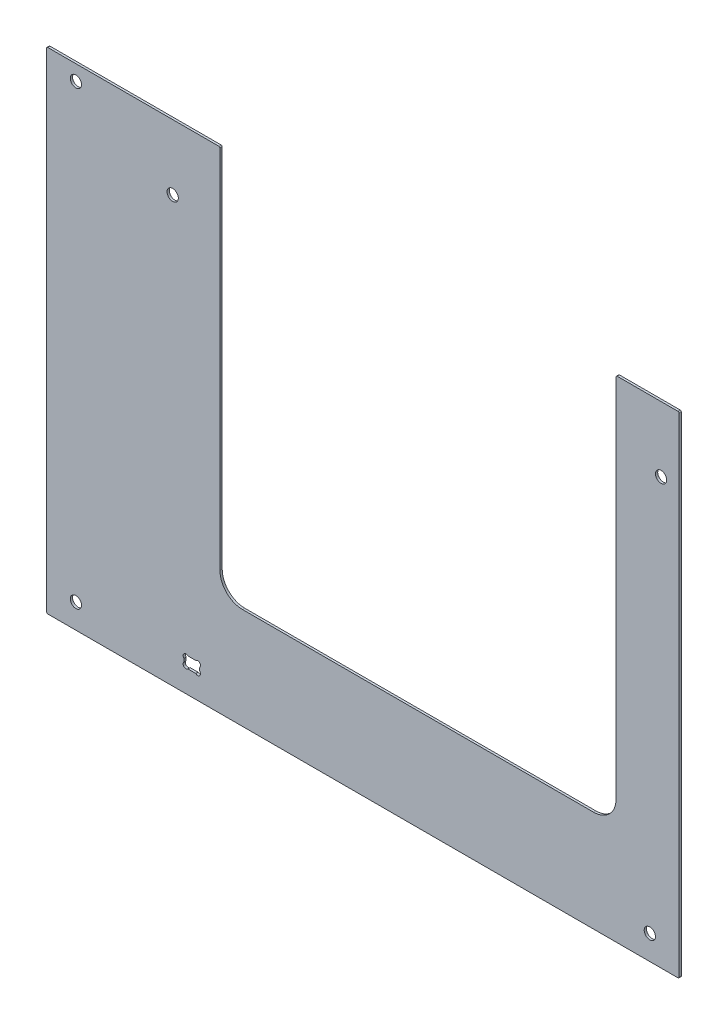
ISO-10303-21;
HEADER;
FILE_DESCRIPTION(('STEP AP214'),'2;1');
FILE_NAME('part.step','',(''),(''),'','','');
FILE_SCHEMA(('AUTOMOTIVE_DESIGN { 1 0 10303 214 1 1 1 1 }'));
ENDSEC;
DATA;
#1=APPLICATION_CONTEXT('core data for automotive mechanical design processes');
#2=APPLICATION_PROTOCOL_DEFINITION('international standard','automotive_design',2000,#1);
#3=PRODUCT_CONTEXT('',#1,'mechanical');
#4=PRODUCT('Part','Part','',(#3));
#5=PRODUCT_RELATED_PRODUCT_CATEGORY('part','',(#4));
#6=PRODUCT_DEFINITION_FORMATION('','',#4);
#7=PRODUCT_DEFINITION_CONTEXT('part definition',#1,'design');
#8=PRODUCT_DEFINITION('design','',#6,#7);
#9=PRODUCT_DEFINITION_SHAPE('','',#8);
#10=(LENGTH_UNIT() NAMED_UNIT(*) SI_UNIT(.MILLI.,.METRE.));
#11=(NAMED_UNIT(*) PLANE_ANGLE_UNIT() SI_UNIT($,.RADIAN.));
#12=(NAMED_UNIT(*) SI_UNIT($,.STERADIAN.) SOLID_ANGLE_UNIT());
#13=UNCERTAINTY_MEASURE_WITH_UNIT(LENGTH_MEASURE(1.E-05),#10,'distance_accuracy_value','');
#14=(GEOMETRIC_REPRESENTATION_CONTEXT(3) GLOBAL_UNCERTAINTY_ASSIGNED_CONTEXT((#13)) GLOBAL_UNIT_ASSIGNED_CONTEXT((#10,
#11,#12)) REPRESENTATION_CONTEXT('',''));
#15=CARTESIAN_POINT('',(0.,0.,0.));
#16=DIRECTION('',(0.,0.,1.));
#17=DIRECTION('',(1.,0.,0.));
#18=AXIS2_PLACEMENT_3D('',#15,#16,#17);
#19=CARTESIAN_POINT('',(243.,55.,1.));
#20=DIRECTION('',(0.,0.,1.));
#21=DIRECTION('',(1.,0.,0.));
#22=AXIS2_PLACEMENT_3D('',#19,#20,#21);
#23=PLANE('',#22);
#24=CARTESIAN_POINT('',(61.8838834764832,10.8838834764832,1.));
#25=DIRECTION('',(0.,0.,1.));
#26=DIRECTION('',(1.,0.,0.));
#27=AXIS2_PLACEMENT_3D('',#24,#25,#26);
#28=CIRCLE('',#27,1.24999999999995);
#29=CARTESIAN_POINT('',(61.,11.7677669529663,1.));
#30=VERTEX_POINT('',#29);
#31=CARTESIAN_POINT('',(62.7677669529663,10.,1.));
#32=VERTEX_POINT('',#31);
#33=EDGE_CURVE('E197',#30,#32,#28,.T.);
#34=ORIENTED_EDGE('',*,*,#33,.F.);
#35=DIRECTION('',(0.,-1.,0.));
#36=VECTOR('',#35,1.);
#37=CARTESIAN_POINT('',(61.,15.,1.));
#38=LINE('',#37,#36);
#39=CARTESIAN_POINT('',(61.,13.2322330470337,1.));
#40=VERTEX_POINT('',#39);
#41=EDGE_CURVE('E211',#40,#30,#38,.T.);
#42=ORIENTED_EDGE('',*,*,#41,.F.);
#43=CARTESIAN_POINT('',(61.8838834764832,14.1161165235168,1.));
#44=DIRECTION('',(0.,0.,1.));
#45=DIRECTION('',(-1.,0.,0.));
#46=AXIS2_PLACEMENT_3D('',#43,#44,#45);
#47=CIRCLE('',#46,1.24999999999995);
#48=CARTESIAN_POINT('',(62.7677669529663,15.,1.));
#49=VERTEX_POINT('',#48);
#50=EDGE_CURVE('E753',#49,#40,#47,.T.);
#51=ORIENTED_EDGE('',*,*,#50,.F.);
#52=DIRECTION('',(-1.,0.,0.));
#53=VECTOR('',#52,1.);
#54=CARTESIAN_POINT('',(61.,15.,1.));
#55=LINE('',#54,#53);
#56=CARTESIAN_POINT('',(66.2322330470337,15.,1.));
#57=VERTEX_POINT('',#56);
#58=EDGE_CURVE('E230',#57,#49,#55,.T.);
#59=ORIENTED_EDGE('',*,*,#58,.F.);
#60=CARTESIAN_POINT('',(67.1161165235169,14.1161165235168,1.));
#61=DIRECTION('',(0.,0.,1.));
#62=DIRECTION('',(1.,0.,0.));
#63=AXIS2_PLACEMENT_3D('',#60,#61,#62);
#64=CIRCLE('',#63,1.24999999999995);
#65=CARTESIAN_POINT('',(68.,13.2322330470337,1.));
#66=VERTEX_POINT('',#65);
#67=EDGE_CURVE('E204',#66,#57,#64,.T.);
#68=ORIENTED_EDGE('',*,*,#67,.F.);
#69=DIRECTION('',(0.,1.,0.));
#70=VECTOR('',#69,1.);
#71=CARTESIAN_POINT('',(68.,15.,1.));
#72=LINE('',#71,#70);
#73=CARTESIAN_POINT('',(68.,11.7677669529663,1.));
#74=VERTEX_POINT('',#73);
#75=EDGE_CURVE('E220',#74,#66,#72,.T.);
#76=ORIENTED_EDGE('',*,*,#75,.F.);
#77=CARTESIAN_POINT('',(67.1161165235169,10.8838834764832,1.));
#78=DIRECTION('',(0.,0.,1.));
#79=DIRECTION('',(-1.,0.,0.));
#80=AXIS2_PLACEMENT_3D('',#77,#78,#79);
#81=CIRCLE('',#80,1.24999999999995);
#82=CARTESIAN_POINT('',(66.2322330470337,10.,1.));
#83=VERTEX_POINT('',#82);
#84=EDGE_CURVE('E761',#83,#74,#81,.T.);
#85=ORIENTED_EDGE('',*,*,#84,.F.);
#86=DIRECTION('',(1.,0.,0.));
#87=VECTOR('',#86,1.);
#88=CARTESIAN_POINT('',(61.,10.,1.));
#89=LINE('',#88,#87);
#90=EDGE_CURVE('E213',#32,#83,#89,.T.);
#91=ORIENTED_EDGE('',*,*,#90,.F.);
#92=EDGE_LOOP('',(#34,#42,#51,#59,#68,#76,#85,#91));
#93=FACE_BOUND('',#92,.T.);
#94=CARTESIAN_POINT('',(273.,189.,1.));
#95=DIRECTION('',(0.,0.,1.));
#96=DIRECTION('',(1.,0.,0.));
#97=AXIS2_PLACEMENT_3D('',#94,#95,#96);
#98=CIRCLE('',#97,2.50000000000002);
#99=CARTESIAN_POINT('',(275.5,189.,1.));
#100=VERTEX_POINT('',#99);
#101=EDGE_CURVE('E736',#100,#100,#98,.T.);
#102=ORIENTED_EDGE('',*,*,#101,.F.);
#103=EDGE_LOOP('',(#102));
#104=FACE_BOUND('',#103,.T.);
#105=CARTESIAN_POINT('',(13.,211.15,1.));
#106=DIRECTION('',(0.,0.,1.));
#107=DIRECTION('',(1.,0.,0.));
#108=AXIS2_PLACEMENT_3D('',#105,#106,#107);
#109=CIRCLE('',#108,2.5);
#110=CARTESIAN_POINT('',(15.5,211.15,1.));
#111=VERTEX_POINT('',#110);
#112=EDGE_CURVE('E246',#111,#111,#109,.T.);
#113=ORIENTED_EDGE('',*,*,#112,.F.);
#114=EDGE_LOOP('',(#113));
#115=FACE_BOUND('',#114,.T.);
#116=DIRECTION('',(0.,-1.,0.));
#117=VECTOR('',#116,1.);
#118=CARTESIAN_POINT('',(0.,0.,1.));
#119=LINE('',#118,#117);
#120=CARTESIAN_POINT('',(0.,217.5,1.));
#121=VERTEX_POINT('',#120);
#122=CARTESIAN_POINT('',(0.,0.5,1.));
#123=VERTEX_POINT('',#122);
#124=EDGE_CURVE('E266',#121,#123,#119,.T.);
#125=ORIENTED_EDGE('',*,*,#124,.T.);
#126=CARTESIAN_POINT('',(0.5,0.5,1.));
#127=DIRECTION('',(0.,0.,1.));
#128=DIRECTION('',(1.,0.,0.));
#129=AXIS2_PLACEMENT_3D('',#126,#127,#128);
#130=CIRCLE('',#129,0.5);
#131=CARTESIAN_POINT('',(0.5,0.,1.));
#132=VERTEX_POINT('',#131);
#133=EDGE_CURVE('E357',#123,#132,#130,.T.);
#134=ORIENTED_EDGE('',*,*,#133,.T.);
#135=DIRECTION('',(1.,0.,0.));
#136=VECTOR('',#135,1.);
#137=CARTESIAN_POINT('',(0.,0.,1.));
#138=LINE('',#137,#136);
#139=CARTESIAN_POINT('',(280.5,0.,1.));
#140=VERTEX_POINT('',#139);
#141=EDGE_CURVE('E269',#132,#140,#138,.T.);
#142=ORIENTED_EDGE('',*,*,#141,.T.);
#143=CARTESIAN_POINT('',(280.5,0.5,1.));
#144=DIRECTION('',(0.,0.,1.));
#145=DIRECTION('',(1.,0.,0.));
#146=AXIS2_PLACEMENT_3D('',#143,#144,#145);
#147=CIRCLE('',#146,0.5);
#148=CARTESIAN_POINT('',(281.,0.5,1.));
#149=VERTEX_POINT('',#148);
#150=EDGE_CURVE('E355',#140,#149,#147,.T.);
#151=ORIENTED_EDGE('',*,*,#150,.T.);
#152=DIRECTION('',(0.,1.,0.));
#153=VECTOR('',#152,1.);
#154=CARTESIAN_POINT('',(281.,0.,1.));
#155=LINE('',#154,#153);
#156=CARTESIAN_POINT('',(281.,217.5,1.));
#157=VERTEX_POINT('',#156);
#158=EDGE_CURVE('E272',#149,#157,#155,.T.);
#159=ORIENTED_EDGE('',*,*,#158,.T.);
#160=CARTESIAN_POINT('',(280.5,217.5,1.));
#161=DIRECTION('',(0.,0.,1.));
#162=DIRECTION('',(1.,0.,0.));
#163=AXIS2_PLACEMENT_3D('',#160,#161,#162);
#164=CIRCLE('',#163,0.5);
#165=CARTESIAN_POINT('',(280.5,218.,1.));
#166=VERTEX_POINT('',#165);
#167=EDGE_CURVE('E353',#157,#166,#164,.T.);
#168=ORIENTED_EDGE('',*,*,#167,.T.);
#169=DIRECTION('',(-1.,0.,0.));
#170=VECTOR('',#169,1.);
#171=CARTESIAN_POINT('',(281.,218.,1.));
#172=LINE('',#171,#170);
#173=CARTESIAN_POINT('',(253.5,218.,1.));
#174=VERTEX_POINT('',#173);
#175=EDGE_CURVE('E275',#166,#174,#172,.T.);
#176=ORIENTED_EDGE('',*,*,#175,.T.);
#177=CARTESIAN_POINT('',(253.5,217.5,1.));
#178=DIRECTION('',(0.,0.,1.));
#179=DIRECTION('',(1.,0.,0.));
#180=AXIS2_PLACEMENT_3D('',#177,#178,#179);
#181=CIRCLE('',#180,0.5);
#182=CARTESIAN_POINT('',(253.,217.5,1.));
#183=VERTEX_POINT('',#182);
#184=EDGE_CURVE('E47',#174,#183,#181,.T.);
#185=ORIENTED_EDGE('',*,*,#184,.T.);
#186=DIRECTION('',(0.,-1.,0.));
#187=VECTOR('',#186,1.);
#188=CARTESIAN_POINT('',(253.,55.0000000000001,1.));
#189=LINE('',#188,#187);
#190=CARTESIAN_POINT('',(253.,55.0000000000001,1.));
#191=VERTEX_POINT('',#190);
#192=EDGE_CURVE('E277',#183,#191,#189,.T.);
#193=ORIENTED_EDGE('',*,*,#192,.T.);
#194=CARTESIAN_POINT('',(243.,55.,1.));
#195=DIRECTION('',(0.,0.,-1.));
#196=DIRECTION('',(1.,0.,0.));
#197=AXIS2_PLACEMENT_3D('',#194,#195,#196);
#198=CIRCLE('',#197,10.);
#199=CARTESIAN_POINT('',(243.,45.,1.));
#200=VERTEX_POINT('',#199);
#201=EDGE_CURVE('E252',#191,#200,#198,.T.);
#202=ORIENTED_EDGE('',*,*,#201,.T.);
#203=DIRECTION('',(-1.,0.,0.));
#204=VECTOR('',#203,1.);
#205=CARTESIAN_POINT('',(87.0000000000001,45.,1.));
#206=LINE('',#205,#204);
#207=CARTESIAN_POINT('',(87.0000000000001,45.,1.));
#208=VERTEX_POINT('',#207);
#209=EDGE_CURVE('E255',#200,#208,#206,.T.);
#210=ORIENTED_EDGE('',*,*,#209,.T.);
#211=CARTESIAN_POINT('',(87.,55.,1.));
#212=DIRECTION('',(0.,0.,-1.));
#213=DIRECTION('',(-1.,0.,0.));
#214=AXIS2_PLACEMENT_3D('',#211,#212,#213);
#215=CIRCLE('',#214,10.);
#216=CARTESIAN_POINT('',(77.,55.0000000000001,1.));
#217=VERTEX_POINT('',#216);
#218=EDGE_CURVE('E258',#208,#217,#215,.T.);
#219=ORIENTED_EDGE('',*,*,#218,.T.);
#220=DIRECTION('',(0.,1.,0.));
#221=VECTOR('',#220,1.);
#222=CARTESIAN_POINT('',(77.,218.,1.));
#223=LINE('',#222,#221);
#224=CARTESIAN_POINT('',(77.,217.5,1.));
#225=VERTEX_POINT('',#224);
#226=EDGE_CURVE('E260',#217,#225,#223,.T.);
#227=ORIENTED_EDGE('',*,*,#226,.T.);
#228=CARTESIAN_POINT('',(76.5,217.5,1.));
#229=DIRECTION('',(0.,0.,1.));
#230=DIRECTION('',(1.,0.,0.));
#231=AXIS2_PLACEMENT_3D('',#228,#229,#230);
#232=CIRCLE('',#231,0.5);
#233=CARTESIAN_POINT('',(76.5,218.,1.));
#234=VERTEX_POINT('',#233);
#235=EDGE_CURVE('E348',#225,#234,#232,.T.);
#236=ORIENTED_EDGE('',*,*,#235,.T.);
#237=DIRECTION('',(-1.,0.,0.));
#238=VECTOR('',#237,1.);
#239=CARTESIAN_POINT('',(0.,218.,1.));
#240=LINE('',#239,#238);
#241=CARTESIAN_POINT('',(0.5,218.,1.));
#242=VERTEX_POINT('',#241);
#243=EDGE_CURVE('E263',#234,#242,#240,.T.);
#244=ORIENTED_EDGE('',*,*,#243,.T.);
#245=CARTESIAN_POINT('',(0.5,217.5,1.));
#246=DIRECTION('',(0.,0.,1.));
#247=DIRECTION('',(1.,0.,0.));
#248=AXIS2_PLACEMENT_3D('',#245,#246,#247);
#249=CIRCLE('',#248,0.5);
#250=EDGE_CURVE('E350',#242,#121,#249,.T.);
#251=ORIENTED_EDGE('',*,*,#250,.T.);
#252=EDGE_LOOP('',(#125,#134,#142,#151,#159,#168,#176,#185,#193,#202,#210,#219,#227,#236,#244,#251));
#253=FACE_BOUND('',#252,.T.);
#254=CARTESIAN_POINT('',(268.,10.85,1.));
#255=DIRECTION('',(0.,0.,1.));
#256=DIRECTION('',(1.,0.,0.));
#257=AXIS2_PLACEMENT_3D('',#254,#255,#256);
#258=CIRCLE('',#257,2.50000000000002);
#259=CARTESIAN_POINT('',(270.5,10.85,1.));
#260=VERTEX_POINT('',#259);
#261=EDGE_CURVE('E240',#260,#260,#258,.T.);
#262=ORIENTED_EDGE('',*,*,#261,.F.);
#263=EDGE_LOOP('',(#262));
#264=FACE_BOUND('',#263,.T.);
#265=CARTESIAN_POINT('',(56.,189.,1.));
#266=DIRECTION('',(0.,0.,1.));
#267=DIRECTION('',(1.,0.,0.));
#268=AXIS2_PLACEMENT_3D('',#265,#266,#267);
#269=CIRCLE('',#268,2.5);
#270=CARTESIAN_POINT('',(58.5,189.,1.));
#271=VERTEX_POINT('',#270);
#272=EDGE_CURVE('E236',#271,#271,#269,.T.);
#273=ORIENTED_EDGE('',*,*,#272,.F.);
#274=EDGE_LOOP('',(#273));
#275=FACE_BOUND('',#274,.T.);
#276=CARTESIAN_POINT('',(13.,10.85,1.));
#277=DIRECTION('',(0.,0.,1.));
#278=DIRECTION('',(1.,0.,0.));
#279=AXIS2_PLACEMENT_3D('',#276,#277,#278);
#280=CIRCLE('',#279,2.5);
#281=CARTESIAN_POINT('',(15.5,10.85,1.));
#282=VERTEX_POINT('',#281);
#283=EDGE_CURVE('E728',#282,#282,#280,.T.);
#284=ORIENTED_EDGE('',*,*,#283,.F.);
#285=EDGE_LOOP('',(#284));
#286=FACE_BOUND('',#285,.T.);
#287=ADVANCED_FACE('F32',(#93,#104,#115,#253,#264,#275,#286),#23,.T.);
#288=CARTESIAN_POINT('',(243.,55.,0.));
#289=DIRECTION('',(0.,0.,1.));
#290=DIRECTION('',(1.,0.,0.));
#291=AXIS2_PLACEMENT_3D('',#288,#289,#290);
#292=PLANE('',#291);
#293=CARTESIAN_POINT('',(273.,189.,0.));
#294=DIRECTION('',(0.,0.,1.));
#295=DIRECTION('',(1.,0.,0.));
#296=AXIS2_PLACEMENT_3D('',#293,#294,#295);
#297=CIRCLE('',#296,2.50000000000002);
#298=CARTESIAN_POINT('',(275.5,189.,0.));
#299=VERTEX_POINT('',#298);
#300=EDGE_CURVE('E731',#299,#299,#297,.T.);
#301=ORIENTED_EDGE('',*,*,#300,.T.);
#302=EDGE_LOOP('',(#301));
#303=FACE_BOUND('',#302,.T.);
#304=DIRECTION('',(0.,-1.,0.));
#305=VECTOR('',#304,1.);
#306=CARTESIAN_POINT('',(61.,15.,0.));
#307=LINE('',#306,#305);
#308=CARTESIAN_POINT('',(61.,13.2322330470337,0.));
#309=VERTEX_POINT('',#308);
#310=CARTESIAN_POINT('',(61.,11.7677669529663,0.));
#311=VERTEX_POINT('',#310);
#312=EDGE_CURVE('E233',#309,#311,#307,.T.);
#313=ORIENTED_EDGE('',*,*,#312,.T.);
#314=CARTESIAN_POINT('',(61.8838834764832,10.8838834764832,0.));
#315=DIRECTION('',(0.,0.,1.));
#316=DIRECTION('',(1.,0.,0.));
#317=AXIS2_PLACEMENT_3D('',#314,#315,#316);
#318=CIRCLE('',#317,1.24999999999995);
#319=CARTESIAN_POINT('',(62.7677669529663,10.,0.));
#320=VERTEX_POINT('',#319);
#321=EDGE_CURVE('E199',#311,#320,#318,.T.);
#322=ORIENTED_EDGE('',*,*,#321,.T.);
#323=DIRECTION('',(1.,0.,0.));
#324=VECTOR('',#323,1.);
#325=CARTESIAN_POINT('',(61.,10.,0.));
#326=LINE('',#325,#324);
#327=CARTESIAN_POINT('',(66.2322330470337,10.,0.));
#328=VERTEX_POINT('',#327);
#329=EDGE_CURVE('E235',#320,#328,#326,.T.);
#330=ORIENTED_EDGE('',*,*,#329,.T.);
#331=CARTESIAN_POINT('',(67.1161165235169,10.8838834764832,0.));
#332=DIRECTION('',(0.,0.,1.));
#333=DIRECTION('',(-1.,0.,0.));
#334=AXIS2_PLACEMENT_3D('',#331,#332,#333);
#335=CIRCLE('',#334,1.24999999999995);
#336=CARTESIAN_POINT('',(68.,11.7677669529663,0.));
#337=VERTEX_POINT('',#336);
#338=EDGE_CURVE('E760',#328,#337,#335,.T.);
#339=ORIENTED_EDGE('',*,*,#338,.T.);
#340=DIRECTION('',(0.,1.,0.));
#341=VECTOR('',#340,1.);
#342=CARTESIAN_POINT('',(68.,15.,0.));
#343=LINE('',#342,#341);
#344=CARTESIAN_POINT('',(68.,13.2322330470337,0.));
#345=VERTEX_POINT('',#344);
#346=EDGE_CURVE('E222',#337,#345,#343,.T.);
#347=ORIENTED_EDGE('',*,*,#346,.T.);
#348=CARTESIAN_POINT('',(67.1161165235169,14.1161165235168,0.));
#349=DIRECTION('',(0.,0.,1.));
#350=DIRECTION('',(1.,0.,0.));
#351=AXIS2_PLACEMENT_3D('',#348,#349,#350);
#352=CIRCLE('',#351,1.24999999999995);
#353=CARTESIAN_POINT('',(66.2322330470337,15.,0.));
#354=VERTEX_POINT('',#353);
#355=EDGE_CURVE('E766',#345,#354,#352,.T.);
#356=ORIENTED_EDGE('',*,*,#355,.T.);
#357=DIRECTION('',(-1.,0.,0.));
#358=VECTOR('',#357,1.);
#359=CARTESIAN_POINT('',(61.,15.,0.));
#360=LINE('',#359,#358);
#361=CARTESIAN_POINT('',(62.7677669529663,15.,0.));
#362=VERTEX_POINT('',#361);
#363=EDGE_CURVE('E218',#354,#362,#360,.T.);
#364=ORIENTED_EDGE('',*,*,#363,.T.);
#365=CARTESIAN_POINT('',(61.8838834764832,14.1161165235168,0.));
#366=DIRECTION('',(0.,0.,1.));
#367=DIRECTION('',(-1.,0.,0.));
#368=AXIS2_PLACEMENT_3D('',#365,#366,#367);
#369=CIRCLE('',#368,1.24999999999995);
#370=EDGE_CURVE('E733',#362,#309,#369,.T.);
#371=ORIENTED_EDGE('',*,*,#370,.T.);
#372=EDGE_LOOP('',(#313,#322,#330,#339,#347,#356,#364,#371));
#373=FACE_BOUND('',#372,.T.);
#374=CARTESIAN_POINT('',(13.,211.15,0.));
#375=DIRECTION('',(0.,0.,1.));
#376=DIRECTION('',(1.,0.,0.));
#377=AXIS2_PLACEMENT_3D('',#374,#375,#376);
#378=CIRCLE('',#377,2.5);
#379=CARTESIAN_POINT('',(15.5,211.15,0.));
#380=VERTEX_POINT('',#379);
#381=EDGE_CURVE('E243',#380,#380,#378,.T.);
#382=ORIENTED_EDGE('',*,*,#381,.T.);
#383=EDGE_LOOP('',(#382));
#384=FACE_BOUND('',#383,.T.);
#385=DIRECTION('',(1.,0.,0.));
#386=VECTOR('',#385,1.);
#387=CARTESIAN_POINT('',(0.,0.,0.));
#388=LINE('',#387,#386);
#389=CARTESIAN_POINT('',(0.5,0.,0.));
#390=VERTEX_POINT('',#389);
#391=CARTESIAN_POINT('',(280.5,0.,0.));
#392=VERTEX_POINT('',#391);
#393=EDGE_CURVE('E295',#390,#392,#388,.T.);
#394=ORIENTED_EDGE('',*,*,#393,.F.);
#395=CARTESIAN_POINT('',(0.5,0.5,0.));
#396=DIRECTION('',(0.,0.,1.));
#397=DIRECTION('',(1.,0.,0.));
#398=AXIS2_PLACEMENT_3D('',#395,#396,#397);
#399=CIRCLE('',#398,0.5);
#400=CARTESIAN_POINT('',(0.,0.5,0.));
#401=VERTEX_POINT('',#400);
#402=EDGE_CURVE('E341',#390,#401,#399,.F.);
#403=ORIENTED_EDGE('',*,*,#402,.T.);
#404=DIRECTION('',(0.,-1.,0.));
#405=VECTOR('',#404,1.);
#406=CARTESIAN_POINT('',(0.,0.,0.));
#407=LINE('',#406,#405);
#408=CARTESIAN_POINT('',(0.,217.5,0.));
#409=VERTEX_POINT('',#408);
#410=EDGE_CURVE('E292',#409,#401,#407,.T.);
#411=ORIENTED_EDGE('',*,*,#410,.F.);
#412=CARTESIAN_POINT('',(0.5,217.5,0.));
#413=DIRECTION('',(0.,0.,1.));
#414=DIRECTION('',(1.,0.,0.));
#415=AXIS2_PLACEMENT_3D('',#412,#413,#414);
#416=CIRCLE('',#415,0.5);
#417=CARTESIAN_POINT('',(0.5,218.,0.));
#418=VERTEX_POINT('',#417);
#419=EDGE_CURVE('E333',#409,#418,#416,.F.);
#420=ORIENTED_EDGE('',*,*,#419,.T.);
#421=DIRECTION('',(-1.,0.,0.));
#422=VECTOR('',#421,1.);
#423=CARTESIAN_POINT('',(0.,218.,0.));
#424=LINE('',#423,#422);
#425=CARTESIAN_POINT('',(76.5,218.,0.));
#426=VERTEX_POINT('',#425);
#427=EDGE_CURVE('E289',#426,#418,#424,.T.);
#428=ORIENTED_EDGE('',*,*,#427,.F.);
#429=CARTESIAN_POINT('',(76.5,217.5,0.));
#430=DIRECTION('',(0.,0.,1.));
#431=DIRECTION('',(1.,0.,0.));
#432=AXIS2_PLACEMENT_3D('',#429,#430,#431);
#433=CIRCLE('',#432,0.5);
#434=CARTESIAN_POINT('',(77.,217.5,0.));
#435=VERTEX_POINT('',#434);
#436=EDGE_CURVE('E331',#426,#435,#433,.F.);
#437=ORIENTED_EDGE('',*,*,#436,.T.);
#438=DIRECTION('',(0.,1.,0.));
#439=VECTOR('',#438,1.);
#440=CARTESIAN_POINT('',(77.,218.,0.));
#441=LINE('',#440,#439);
#442=CARTESIAN_POINT('',(77.,55.0000000000001,0.));
#443=VERTEX_POINT('',#442);
#444=EDGE_CURVE('E286',#443,#435,#441,.T.);
#445=ORIENTED_EDGE('',*,*,#444,.F.);
#446=CARTESIAN_POINT('',(87.,55.,0.));
#447=DIRECTION('',(0.,0.,-1.));
#448=DIRECTION('',(-1.,0.,0.));
#449=AXIS2_PLACEMENT_3D('',#446,#447,#448);
#450=CIRCLE('',#449,10.);
#451=CARTESIAN_POINT('',(87.0000000000001,45.,0.));
#452=VERTEX_POINT('',#451);
#453=EDGE_CURVE('E284',#452,#443,#450,.T.);
#454=ORIENTED_EDGE('',*,*,#453,.F.);
#455=DIRECTION('',(-1.,0.,0.));
#456=VECTOR('',#455,1.);
#457=CARTESIAN_POINT('',(87.0000000000001,45.,0.));
#458=LINE('',#457,#456);
#459=CARTESIAN_POINT('',(243.,45.,0.));
#460=VERTEX_POINT('',#459);
#461=EDGE_CURVE('E282',#460,#452,#458,.T.);
#462=ORIENTED_EDGE('',*,*,#461,.F.);
#463=CARTESIAN_POINT('',(243.,55.,0.));
#464=DIRECTION('',(0.,0.,-1.));
#465=DIRECTION('',(1.,0.,0.));
#466=AXIS2_PLACEMENT_3D('',#463,#464,#465);
#467=CIRCLE('',#466,10.);
#468=CARTESIAN_POINT('',(253.,55.0000000000001,0.));
#469=VERTEX_POINT('',#468);
#470=EDGE_CURVE('E249',#469,#460,#467,.T.);
#471=ORIENTED_EDGE('',*,*,#470,.F.);
#472=DIRECTION('',(0.,-1.,0.));
#473=VECTOR('',#472,1.);
#474=CARTESIAN_POINT('',(253.,55.0000000000001,0.));
#475=LINE('',#474,#473);
#476=CARTESIAN_POINT('',(253.,217.5,0.));
#477=VERTEX_POINT('',#476);
#478=EDGE_CURVE('E256',#477,#469,#475,.T.);
#479=ORIENTED_EDGE('',*,*,#478,.F.);
#480=CARTESIAN_POINT('',(253.5,217.5,0.));
#481=DIRECTION('',(0.,0.,1.));
#482=DIRECTION('',(1.,0.,0.));
#483=AXIS2_PLACEMENT_3D('',#480,#481,#482);
#484=CIRCLE('',#483,0.5);
#485=CARTESIAN_POINT('',(253.5,218.,0.));
#486=VERTEX_POINT('',#485);
#487=EDGE_CURVE('E335',#477,#486,#484,.F.);
#488=ORIENTED_EDGE('',*,*,#487,.T.);
#489=DIRECTION('',(-1.,0.,0.));
#490=VECTOR('',#489,1.);
#491=CARTESIAN_POINT('',(281.,218.,0.));
#492=LINE('',#491,#490);
#493=CARTESIAN_POINT('',(280.5,218.,0.));
#494=VERTEX_POINT('',#493);
#495=EDGE_CURVE('E301',#494,#486,#492,.T.);
#496=ORIENTED_EDGE('',*,*,#495,.F.);
#497=CARTESIAN_POINT('',(280.5,217.5,0.));
#498=DIRECTION('',(0.,0.,1.));
#499=DIRECTION('',(1.,0.,0.));
#500=AXIS2_PLACEMENT_3D('',#497,#498,#499);
#501=CIRCLE('',#500,0.5);
#502=CARTESIAN_POINT('',(281.,217.5,0.));
#503=VERTEX_POINT('',#502);
#504=EDGE_CURVE('E337',#494,#503,#501,.F.);
#505=ORIENTED_EDGE('',*,*,#504,.T.);
#506=DIRECTION('',(0.,1.,0.));
#507=VECTOR('',#506,1.);
#508=CARTESIAN_POINT('',(281.,0.,0.));
#509=LINE('',#508,#507);
#510=CARTESIAN_POINT('',(281.,0.5,0.));
#511=VERTEX_POINT('',#510);
#512=EDGE_CURVE('E298',#511,#503,#509,.T.);
#513=ORIENTED_EDGE('',*,*,#512,.F.);
#514=CARTESIAN_POINT('',(280.5,0.5,0.));
#515=DIRECTION('',(0.,0.,1.));
#516=DIRECTION('',(1.,0.,0.));
#517=AXIS2_PLACEMENT_3D('',#514,#515,#516);
#518=CIRCLE('',#517,0.5);
#519=EDGE_CURVE('E339',#511,#392,#518,.F.);
#520=ORIENTED_EDGE('',*,*,#519,.T.);
#521=EDGE_LOOP('',(#394,#403,#411,#420,#428,#437,#445,#454,#462,#471,#479,#488,#496,#505,#513,#520));
#522=FACE_BOUND('',#521,.T.);
#523=CARTESIAN_POINT('',(268.,10.85,0.));
#524=DIRECTION('',(0.,0.,1.));
#525=DIRECTION('',(1.,0.,0.));
#526=AXIS2_PLACEMENT_3D('',#523,#524,#525);
#527=CIRCLE('',#526,2.50000000000002);
#528=CARTESIAN_POINT('',(270.5,10.85,0.));
#529=VERTEX_POINT('',#528);
#530=EDGE_CURVE('E232',#529,#529,#527,.T.);
#531=ORIENTED_EDGE('',*,*,#530,.T.);
#532=EDGE_LOOP('',(#531));
#533=FACE_BOUND('',#532,.T.);
#534=CARTESIAN_POINT('',(56.,189.,0.));
#535=DIRECTION('',(0.,0.,1.));
#536=DIRECTION('',(1.,0.,0.));
#537=AXIS2_PLACEMENT_3D('',#534,#535,#536);
#538=CIRCLE('',#537,2.5);
#539=CARTESIAN_POINT('',(58.5,189.,0.));
#540=VERTEX_POINT('',#539);
#541=EDGE_CURVE('E225',#540,#540,#538,.T.);
#542=ORIENTED_EDGE('',*,*,#541,.T.);
#543=EDGE_LOOP('',(#542));
#544=FACE_BOUND('',#543,.T.);
#545=CARTESIAN_POINT('',(13.,10.85,0.));
#546=DIRECTION('',(0.,0.,1.));
#547=DIRECTION('',(1.,0.,0.));
#548=AXIS2_PLACEMENT_3D('',#545,#546,#547);
#549=CIRCLE('',#548,2.5);
#550=CARTESIAN_POINT('',(15.5,10.85,0.));
#551=VERTEX_POINT('',#550);
#552=EDGE_CURVE('E726',#551,#551,#549,.T.);
#553=ORIENTED_EDGE('',*,*,#552,.T.);
#554=EDGE_LOOP('',(#553));
#555=FACE_BOUND('',#554,.T.);
#556=ADVANCED_FACE('F392',(#303,#373,#384,#522,#533,#544,#555),#292,.F.);
#557=CARTESIAN_POINT('',(243.,55.,1.));
#558=DIRECTION('',(0.,0.,-1.));
#559=DIRECTION('',(-1.,0.,0.));
#560=AXIS2_PLACEMENT_3D('',#557,#558,#559);
#561=CYLINDRICAL_SURFACE('',#560,10.);
#562=ORIENTED_EDGE('',*,*,#470,.T.);
#563=DIRECTION('',(0.,0.,-1.));
#564=VECTOR('',#563,1.);
#565=CARTESIAN_POINT('',(243.,45.,1.));
#566=LINE('',#565,#564);
#567=EDGE_CURVE('E312',#200,#460,#566,.T.);
#568=ORIENTED_EDGE('',*,*,#567,.F.);
#569=ORIENTED_EDGE('',*,*,#201,.F.);
#570=DIRECTION('',(0.,0.,-1.));
#571=VECTOR('',#570,1.);
#572=CARTESIAN_POINT('',(253.,55.0000000000001,1.));
#573=LINE('',#572,#571);
#574=EDGE_CURVE('E279',#191,#469,#573,.T.);
#575=ORIENTED_EDGE('',*,*,#574,.T.);
#576=EDGE_LOOP('',(#562,#568,#569,#575));
#577=FACE_BOUND('',#576,.T.);
#578=ADVANCED_FACE('F428',(#577),#561,.F.);
#579=CARTESIAN_POINT('',(87.0000000000001,45.,1.));
#580=DIRECTION('',(0.,-1.,0.));
#581=DIRECTION('',(0.,0.,-1.));
#582=AXIS2_PLACEMENT_3D('',#579,#580,#581);
#583=PLANE('',#582);
#584=ORIENTED_EDGE('',*,*,#461,.T.);
#585=DIRECTION('',(0.,0.,-1.));
#586=VECTOR('',#585,1.);
#587=CARTESIAN_POINT('',(87.0000000000001,45.,1.));
#588=LINE('',#587,#586);
#589=EDGE_CURVE('E309',#208,#452,#588,.T.);
#590=ORIENTED_EDGE('',*,*,#589,.F.);
#591=ORIENTED_EDGE('',*,*,#209,.F.);
#592=ORIENTED_EDGE('',*,*,#567,.T.);
#593=EDGE_LOOP('',(#584,#590,#591,#592));
#594=FACE_BOUND('',#593,.T.);
#595=ADVANCED_FACE('F434',(#594),#583,.F.);
#596=CARTESIAN_POINT('',(87.,55.,1.));
#597=DIRECTION('',(0.,0.,-1.));
#598=DIRECTION('',(-1.,0.,0.));
#599=AXIS2_PLACEMENT_3D('',#596,#597,#598);
#600=CYLINDRICAL_SURFACE('',#599,10.);
#601=ORIENTED_EDGE('',*,*,#453,.T.);
#602=DIRECTION('',(0.,0.,-1.));
#603=VECTOR('',#602,1.);
#604=CARTESIAN_POINT('',(77.,55.0000000000001,1.));
#605=LINE('',#604,#603);
#606=EDGE_CURVE('E306',#217,#443,#605,.T.);
#607=ORIENTED_EDGE('',*,*,#606,.F.);
#608=ORIENTED_EDGE('',*,*,#218,.F.);
#609=ORIENTED_EDGE('',*,*,#589,.T.);
#610=EDGE_LOOP('',(#601,#607,#608,#609));
#611=FACE_BOUND('',#610,.T.);
#612=ADVANCED_FACE('F436',(#611),#600,.F.);
#613=CARTESIAN_POINT('',(77.,218.,1.));
#614=DIRECTION('',(-1.,0.,0.));
#615=DIRECTION('',(0.,-1.,0.));
#616=AXIS2_PLACEMENT_3D('',#613,#614,#615);
#617=PLANE('',#616);
#618=ORIENTED_EDGE('',*,*,#444,.T.);
#619=DIRECTION('',(0.,0.,-1.));
#620=VECTOR('',#619,1.);
#621=CARTESIAN_POINT('',(77.,217.5,1.));
#622=LINE('',#621,#620);
#623=EDGE_CURVE('E11',#435,#225,#622,.F.);
#624=ORIENTED_EDGE('',*,*,#623,.T.);
#625=ORIENTED_EDGE('',*,*,#226,.F.);
#626=ORIENTED_EDGE('',*,*,#606,.T.);
#627=EDGE_LOOP('',(#618,#624,#625,#626));
#628=FACE_BOUND('',#627,.T.);
#629=ADVANCED_FACE('F440',(#628),#617,.F.);
#630=CARTESIAN_POINT('',(0.,218.,1.));
#631=DIRECTION('',(0.,-1.,0.));
#632=DIRECTION('',(0.,0.,-1.));
#633=AXIS2_PLACEMENT_3D('',#630,#631,#632);
#634=PLANE('',#633);
#635=ORIENTED_EDGE('',*,*,#427,.T.);
#636=DIRECTION('',(0.,0.,-1.));
#637=VECTOR('',#636,1.);
#638=CARTESIAN_POINT('',(0.5,218.,1.));
#639=LINE('',#638,#637);
#640=EDGE_CURVE('E40',#418,#242,#639,.F.);
#641=ORIENTED_EDGE('',*,*,#640,.T.);
#642=ORIENTED_EDGE('',*,*,#243,.F.);
#643=DIRECTION('',(0.,0.,-1.));
#644=VECTOR('',#643,1.);
#645=CARTESIAN_POINT('',(76.5,218.,1.));
#646=LINE('',#645,#644);
#647=EDGE_CURVE('E371',#234,#426,#646,.T.);
#648=ORIENTED_EDGE('',*,*,#647,.T.);
#649=EDGE_LOOP('',(#635,#641,#642,#648));
#650=FACE_BOUND('',#649,.T.);
#651=ADVANCED_FACE('F376',(#650),#634,.F.);
#652=CARTESIAN_POINT('',(0.,0.,1.));
#653=DIRECTION('',(1.,0.,0.));
#654=DIRECTION('',(0.,0.,-1.));
#655=AXIS2_PLACEMENT_3D('',#652,#653,#654);
#656=PLANE('',#655);
#657=ORIENTED_EDGE('',*,*,#410,.T.);
#658=DIRECTION('',(0.,0.,-1.));
#659=VECTOR('',#658,1.);
#660=CARTESIAN_POINT('',(0.,0.5,1.));
#661=LINE('',#660,#659);
#662=EDGE_CURVE('E346',#401,#123,#661,.F.);
#663=ORIENTED_EDGE('',*,*,#662,.T.);
#664=ORIENTED_EDGE('',*,*,#124,.F.);
#665=DIRECTION('',(0.,0.,-1.));
#666=VECTOR('',#665,1.);
#667=CARTESIAN_POINT('',(0.,217.5,1.));
#668=LINE('',#667,#666);
#669=EDGE_CURVE('E343',#121,#409,#668,.T.);
#670=ORIENTED_EDGE('',*,*,#669,.T.);
#671=EDGE_LOOP('',(#657,#663,#664,#670));
#672=FACE_BOUND('',#671,.T.);
#673=ADVANCED_FACE('F388',(#672),#656,.F.);
#674=CARTESIAN_POINT('',(0.,0.,1.));
#675=DIRECTION('',(0.,1.,0.));
#676=DIRECTION('',(0.,0.,1.));
#677=AXIS2_PLACEMENT_3D('',#674,#675,#676);
#678=PLANE('',#677);
#679=ORIENTED_EDGE('',*,*,#141,.F.);
#680=DIRECTION('',(0.,0.,-1.));
#681=VECTOR('',#680,1.);
#682=CARTESIAN_POINT('',(0.5,0.,1.));
#683=LINE('',#682,#681);
#684=EDGE_CURVE('E328',#132,#390,#683,.T.);
#685=ORIENTED_EDGE('',*,*,#684,.T.);
#686=ORIENTED_EDGE('',*,*,#393,.T.);
#687=DIRECTION('',(0.,0.,-1.));
#688=VECTOR('',#687,1.);
#689=CARTESIAN_POINT('',(280.5,0.,1.));
#690=LINE('',#689,#688);
#691=EDGE_CURVE('E326',#392,#140,#690,.F.);
#692=ORIENTED_EDGE('',*,*,#691,.T.);
#693=EDGE_LOOP('',(#679,#685,#686,#692));
#694=FACE_BOUND('',#693,.T.);
#695=ADVANCED_FACE('F400',(#694),#678,.F.);
#696=CARTESIAN_POINT('',(281.,0.,1.));
#697=DIRECTION('',(-1.,0.,0.));
#698=DIRECTION('',(0.,0.,1.));
#699=AXIS2_PLACEMENT_3D('',#696,#697,#698);
#700=PLANE('',#699);
#701=ORIENTED_EDGE('',*,*,#158,.F.);
#702=DIRECTION('',(0.,0.,-1.));
#703=VECTOR('',#702,1.);
#704=CARTESIAN_POINT('',(281.,0.5,1.));
#705=LINE('',#704,#703);
#706=EDGE_CURVE('E361',#149,#511,#705,.T.);
#707=ORIENTED_EDGE('',*,*,#706,.T.);
#708=ORIENTED_EDGE('',*,*,#512,.T.);
#709=DIRECTION('',(0.,0.,-1.));
#710=VECTOR('',#709,1.);
#711=CARTESIAN_POINT('',(281.,217.5,1.));
#712=LINE('',#711,#710);
#713=EDGE_CURVE('E359',#503,#157,#712,.F.);
#714=ORIENTED_EDGE('',*,*,#713,.T.);
#715=EDGE_LOOP('',(#701,#707,#708,#714));
#716=FACE_BOUND('',#715,.T.);
#717=ADVANCED_FACE('F409',(#716),#700,.F.);
#718=CARTESIAN_POINT('',(281.,218.,1.));
#719=DIRECTION('',(0.,-1.,0.));
#720=DIRECTION('',(0.,0.,-1.));
#721=AXIS2_PLACEMENT_3D('',#718,#719,#720);
#722=PLANE('',#721);
#723=ORIENTED_EDGE('',*,*,#175,.F.);
#724=DIRECTION('',(0.,0.,-1.));
#725=VECTOR('',#724,1.);
#726=CARTESIAN_POINT('',(280.5,218.,1.));
#727=LINE('',#726,#725);
#728=EDGE_CURVE('E365',#166,#494,#727,.T.);
#729=ORIENTED_EDGE('',*,*,#728,.T.);
#730=ORIENTED_EDGE('',*,*,#495,.T.);
#731=DIRECTION('',(0.,0.,-1.));
#732=VECTOR('',#731,1.);
#733=CARTESIAN_POINT('',(253.5,218.,1.));
#734=LINE('',#733,#732);
#735=EDGE_CURVE('E55',#486,#174,#734,.F.);
#736=ORIENTED_EDGE('',*,*,#735,.T.);
#737=EDGE_LOOP('',(#723,#729,#730,#736));
#738=FACE_BOUND('',#737,.T.);
#739=ADVANCED_FACE('F416',(#738),#722,.F.);
#740=CARTESIAN_POINT('',(253.,55.0000000000001,1.));
#741=DIRECTION('',(1.,0.,0.));
#742=DIRECTION('',(0.,0.,-1.));
#743=AXIS2_PLACEMENT_3D('',#740,#741,#742);
#744=PLANE('',#743);
#745=ORIENTED_EDGE('',*,*,#192,.F.);
#746=DIRECTION('',(0.,0.,-1.));
#747=VECTOR('',#746,1.);
#748=CARTESIAN_POINT('',(253.,217.5,1.));
#749=LINE('',#748,#747);
#750=EDGE_CURVE('E368',#183,#477,#749,.T.);
#751=ORIENTED_EDGE('',*,*,#750,.T.);
#752=ORIENTED_EDGE('',*,*,#478,.T.);
#753=ORIENTED_EDGE('',*,*,#574,.F.);
#754=EDGE_LOOP('',(#745,#751,#752,#753));
#755=FACE_BOUND('',#754,.T.);
#756=ADVANCED_FACE('F422',(#755),#744,.F.);
#757=CARTESIAN_POINT('',(13.,211.15,1.));
#758=DIRECTION('',(0.,0.,-1.));
#759=DIRECTION('',(-1.,0.,0.));
#760=AXIS2_PLACEMENT_3D('',#757,#758,#759);
#761=CYLINDRICAL_SURFACE('',#760,2.5);
#762=ORIENTED_EDGE('',*,*,#112,.T.);
#763=EDGE_LOOP('',(#762));
#764=FACE_BOUND('',#763,.T.);
#765=ORIENTED_EDGE('',*,*,#381,.F.);
#766=EDGE_LOOP('',(#765));
#767=FACE_BOUND('',#766,.T.);
#768=ADVANCED_FACE('F455',(#764,#767),#761,.F.);
#769=CARTESIAN_POINT('',(268.,10.85,1.));
#770=DIRECTION('',(0.,0.,-1.));
#771=DIRECTION('',(-1.,0.,0.));
#772=AXIS2_PLACEMENT_3D('',#769,#770,#771);
#773=CYLINDRICAL_SURFACE('',#772,2.50000000000002);
#774=ORIENTED_EDGE('',*,*,#261,.T.);
#775=EDGE_LOOP('',(#774));
#776=FACE_BOUND('',#775,.T.);
#777=ORIENTED_EDGE('',*,*,#530,.F.);
#778=EDGE_LOOP('',(#777));
#779=FACE_BOUND('',#778,.T.);
#780=ADVANCED_FACE('F613',(#776,#779),#773,.F.);
#781=CARTESIAN_POINT('',(61.,15.,1.));
#782=DIRECTION('',(1.,0.,0.));
#783=DIRECTION('',(0.,0.,-1.));
#784=AXIS2_PLACEMENT_3D('',#781,#782,#783);
#785=PLANE('',#784);
#786=DIRECTION('',(0.,0.,1.));
#787=VECTOR('',#786,1.);
#788=CARTESIAN_POINT('',(61.,11.7677669529663,0.));
#789=LINE('',#788,#787);
#790=EDGE_CURVE('E193',#311,#30,#789,.T.);
#791=ORIENTED_EDGE('',*,*,#790,.F.);
#792=ORIENTED_EDGE('',*,*,#312,.F.);
#793=DIRECTION('',(0.,0.,1.));
#794=VECTOR('',#793,1.);
#795=CARTESIAN_POINT('',(61.,13.2322330470337,0.));
#796=LINE('',#795,#794);
#797=EDGE_CURVE('E217',#40,#309,#796,.F.);
#798=ORIENTED_EDGE('',*,*,#797,.F.);
#799=ORIENTED_EDGE('',*,*,#41,.T.);
#800=EDGE_LOOP('',(#791,#792,#798,#799));
#801=FACE_BOUND('',#800,.T.);
#802=ADVANCED_FACE('F216',(#801),#785,.T.);
#803=CARTESIAN_POINT('',(61.,10.,1.));
#804=DIRECTION('',(0.,1.,0.));
#805=DIRECTION('',(0.,0.,1.));
#806=AXIS2_PLACEMENT_3D('',#803,#804,#805);
#807=PLANE('',#806);
#808=DIRECTION('',(0.,0.,1.));
#809=VECTOR('',#808,1.);
#810=CARTESIAN_POINT('',(62.7677669529663,10.,0.));
#811=LINE('',#810,#809);
#812=EDGE_CURVE('E324',#32,#320,#811,.F.);
#813=ORIENTED_EDGE('',*,*,#812,.F.);
#814=ORIENTED_EDGE('',*,*,#90,.T.);
#815=DIRECTION('',(0.,0.,1.));
#816=VECTOR('',#815,1.);
#817=CARTESIAN_POINT('',(66.2322330470337,10.,0.));
#818=LINE('',#817,#816);
#819=EDGE_CURVE('E755',#328,#83,#818,.T.);
#820=ORIENTED_EDGE('',*,*,#819,.F.);
#821=ORIENTED_EDGE('',*,*,#329,.F.);
#822=EDGE_LOOP('',(#813,#814,#820,#821));
#823=FACE_BOUND('',#822,.T.);
#824=ADVANCED_FACE('F597',(#823),#807,.T.);
#825=CARTESIAN_POINT('',(68.,15.,1.));
#826=DIRECTION('',(-1.,0.,0.));
#827=DIRECTION('',(0.,0.,1.));
#828=AXIS2_PLACEMENT_3D('',#825,#826,#827);
#829=PLANE('',#828);
#830=DIRECTION('',(0.,0.,1.));
#831=VECTOR('',#830,1.);
#832=CARTESIAN_POINT('',(68.,13.2322330470337,0.));
#833=LINE('',#832,#831);
#834=EDGE_CURVE('E763',#345,#66,#833,.T.);
#835=ORIENTED_EDGE('',*,*,#834,.F.);
#836=ORIENTED_EDGE('',*,*,#346,.F.);
#837=DIRECTION('',(0.,0.,1.));
#838=VECTOR('',#837,1.);
#839=CARTESIAN_POINT('',(68.,11.7677669529663,0.));
#840=LINE('',#839,#838);
#841=EDGE_CURVE('E318',#74,#337,#840,.F.);
#842=ORIENTED_EDGE('',*,*,#841,.F.);
#843=ORIENTED_EDGE('',*,*,#75,.T.);
#844=EDGE_LOOP('',(#835,#836,#842,#843));
#845=FACE_BOUND('',#844,.T.);
#846=ADVANCED_FACE('F588',(#845),#829,.T.);
#847=CARTESIAN_POINT('',(61.,15.,1.));
#848=DIRECTION('',(0.,-1.,0.));
#849=DIRECTION('',(0.,0.,-1.));
#850=AXIS2_PLACEMENT_3D('',#847,#848,#849);
#851=PLANE('',#850);
#852=DIRECTION('',(0.,0.,1.));
#853=VECTOR('',#852,1.);
#854=CARTESIAN_POINT('',(66.2322330470337,15.,0.));
#855=LINE('',#854,#853);
#856=EDGE_CURVE('E321',#57,#354,#855,.F.);
#857=ORIENTED_EDGE('',*,*,#856,.F.);
#858=ORIENTED_EDGE('',*,*,#58,.T.);
#859=DIRECTION('',(0.,0.,1.));
#860=VECTOR('',#859,1.);
#861=CARTESIAN_POINT('',(62.7677669529663,15.,0.));
#862=LINE('',#861,#860);
#863=EDGE_CURVE('E315',#362,#49,#862,.T.);
#864=ORIENTED_EDGE('',*,*,#863,.F.);
#865=ORIENTED_EDGE('',*,*,#363,.F.);
#866=EDGE_LOOP('',(#857,#858,#864,#865));
#867=FACE_BOUND('',#866,.T.);
#868=ADVANCED_FACE('F579',(#867),#851,.T.);
#869=CARTESIAN_POINT('',(56.,189.,1.));
#870=DIRECTION('',(0.,0.,-1.));
#871=DIRECTION('',(-1.,0.,0.));
#872=AXIS2_PLACEMENT_3D('',#869,#870,#871);
#873=CYLINDRICAL_SURFACE('',#872,2.5);
#874=ORIENTED_EDGE('',*,*,#272,.T.);
#875=EDGE_LOOP('',(#874));
#876=FACE_BOUND('',#875,.T.);
#877=ORIENTED_EDGE('',*,*,#541,.F.);
#878=EDGE_LOOP('',(#877));
#879=FACE_BOUND('',#878,.T.);
#880=ADVANCED_FACE('F570',(#876,#879),#873,.F.);
#881=CARTESIAN_POINT('',(273.,189.,1.));
#882=DIRECTION('',(0.,0.,-1.));
#883=DIRECTION('',(-1.,0.,0.));
#884=AXIS2_PLACEMENT_3D('',#881,#882,#883);
#885=CYLINDRICAL_SURFACE('',#884,2.50000000000002);
#886=ORIENTED_EDGE('',*,*,#101,.T.);
#887=EDGE_LOOP('',(#886));
#888=FACE_BOUND('',#887,.T.);
#889=ORIENTED_EDGE('',*,*,#300,.F.);
#890=EDGE_LOOP('',(#889));
#891=FACE_BOUND('',#890,.T.);
#892=ADVANCED_FACE('F560',(#888,#891),#885,.F.);
#893=CARTESIAN_POINT('',(13.,10.85,1.));
#894=DIRECTION('',(0.,0.,-1.));
#895=DIRECTION('',(-1.,0.,0.));
#896=AXIS2_PLACEMENT_3D('',#893,#894,#895);
#897=CYLINDRICAL_SURFACE('',#896,2.5);
#898=ORIENTED_EDGE('',*,*,#283,.T.);
#899=EDGE_LOOP('',(#898));
#900=FACE_BOUND('',#899,.T.);
#901=ORIENTED_EDGE('',*,*,#552,.F.);
#902=EDGE_LOOP('',(#901));
#903=FACE_BOUND('',#902,.T.);
#904=ADVANCED_FACE('F550',(#900,#903),#897,.F.);
#905=CARTESIAN_POINT('',(61.8838834764832,14.1161165235168,0.));
#906=DIRECTION('',(0.,0.,1.));
#907=DIRECTION('',(1.,0.,0.));
#908=AXIS2_PLACEMENT_3D('',#905,#906,#907);
#909=CYLINDRICAL_SURFACE('',#908,1.24999999999995);
#910=ORIENTED_EDGE('',*,*,#797,.T.);
#911=ORIENTED_EDGE('',*,*,#370,.F.);
#912=ORIENTED_EDGE('',*,*,#863,.T.);
#913=ORIENTED_EDGE('',*,*,#50,.T.);
#914=EDGE_LOOP('',(#910,#911,#912,#913));
#915=FACE_BOUND('',#914,.T.);
#916=ADVANCED_FACE('F541',(#915),#909,.F.);
#917=CARTESIAN_POINT('',(67.1161165235169,10.8838834764832,0.));
#918=DIRECTION('',(0.,0.,1.));
#919=DIRECTION('',(1.,0.,0.));
#920=AXIS2_PLACEMENT_3D('',#917,#918,#919);
#921=CYLINDRICAL_SURFACE('',#920,1.24999999999995);
#922=ORIENTED_EDGE('',*,*,#819,.T.);
#923=ORIENTED_EDGE('',*,*,#84,.T.);
#924=ORIENTED_EDGE('',*,*,#841,.T.);
#925=ORIENTED_EDGE('',*,*,#338,.F.);
#926=EDGE_LOOP('',(#922,#923,#924,#925));
#927=FACE_BOUND('',#926,.T.);
#928=ADVANCED_FACE('F532',(#927),#921,.F.);
#929=CARTESIAN_POINT('',(67.1161165235169,14.1161165235168,0.));
#930=DIRECTION('',(0.,0.,1.));
#931=DIRECTION('',(1.,0.,0.));
#932=AXIS2_PLACEMENT_3D('',#929,#930,#931);
#933=CYLINDRICAL_SURFACE('',#932,1.24999999999995);
#934=ORIENTED_EDGE('',*,*,#834,.T.);
#935=ORIENTED_EDGE('',*,*,#67,.T.);
#936=ORIENTED_EDGE('',*,*,#856,.T.);
#937=ORIENTED_EDGE('',*,*,#355,.F.);
#938=EDGE_LOOP('',(#934,#935,#936,#937));
#939=FACE_BOUND('',#938,.T.);
#940=ADVANCED_FACE('F524',(#939),#933,.F.);
#941=CARTESIAN_POINT('',(61.8838834764832,10.8838834764832,0.));
#942=DIRECTION('',(0.,0.,1.));
#943=DIRECTION('',(1.,0.,0.));
#944=AXIS2_PLACEMENT_3D('',#941,#942,#943);
#945=CYLINDRICAL_SURFACE('',#944,1.24999999999995);
#946=ORIENTED_EDGE('',*,*,#790,.T.);
#947=ORIENTED_EDGE('',*,*,#33,.T.);
#948=ORIENTED_EDGE('',*,*,#812,.T.);
#949=ORIENTED_EDGE('',*,*,#321,.F.);
#950=EDGE_LOOP('',(#946,#947,#948,#949));
#951=FACE_BOUND('',#950,.T.);
#952=ADVANCED_FACE('F195',(#951),#945,.F.);
#953=CARTESIAN_POINT('',(0.5,0.5,1.));
#954=DIRECTION('',(0.,0.,-1.));
#955=DIRECTION('',(-1.,0.,0.));
#956=AXIS2_PLACEMENT_3D('',#953,#954,#955);
#957=CYLINDRICAL_SURFACE('',#956,0.5);
#958=ORIENTED_EDGE('',*,*,#133,.F.);
#959=ORIENTED_EDGE('',*,*,#662,.F.);
#960=ORIENTED_EDGE('',*,*,#402,.F.);
#961=ORIENTED_EDGE('',*,*,#684,.F.);
#962=EDGE_LOOP('',(#958,#959,#960,#961));
#963=FACE_BOUND('',#962,.T.);
#964=ADVANCED_FACE('F397',(#963),#957,.T.);
#965=CARTESIAN_POINT('',(280.5,0.5,1.));
#966=DIRECTION('',(0.,0.,-1.));
#967=DIRECTION('',(-1.,0.,0.));
#968=AXIS2_PLACEMENT_3D('',#965,#966,#967);
#969=CYLINDRICAL_SURFACE('',#968,0.5);
#970=ORIENTED_EDGE('',*,*,#150,.F.);
#971=ORIENTED_EDGE('',*,*,#691,.F.);
#972=ORIENTED_EDGE('',*,*,#519,.F.);
#973=ORIENTED_EDGE('',*,*,#706,.F.);
#974=EDGE_LOOP('',(#970,#971,#972,#973));
#975=FACE_BOUND('',#974,.T.);
#976=ADVANCED_FACE('F406',(#975),#969,.T.);
#977=CARTESIAN_POINT('',(280.5,217.5,1.));
#978=DIRECTION('',(0.,0.,-1.));
#979=DIRECTION('',(-1.,0.,0.));
#980=AXIS2_PLACEMENT_3D('',#977,#978,#979);
#981=CYLINDRICAL_SURFACE('',#980,0.5);
#982=ORIENTED_EDGE('',*,*,#167,.F.);
#983=ORIENTED_EDGE('',*,*,#713,.F.);
#984=ORIENTED_EDGE('',*,*,#504,.F.);
#985=ORIENTED_EDGE('',*,*,#728,.F.);
#986=EDGE_LOOP('',(#982,#983,#984,#985));
#987=FACE_BOUND('',#986,.T.);
#988=ADVANCED_FACE('F415',(#987),#981,.T.);
#989=CARTESIAN_POINT('',(253.5,217.5,1.));
#990=DIRECTION('',(0.,0.,-1.));
#991=DIRECTION('',(-1.,0.,0.));
#992=AXIS2_PLACEMENT_3D('',#989,#990,#991);
#993=CYLINDRICAL_SURFACE('',#992,0.5);
#994=ORIENTED_EDGE('',*,*,#184,.F.);
#995=ORIENTED_EDGE('',*,*,#735,.F.);
#996=ORIENTED_EDGE('',*,*,#487,.F.);
#997=ORIENTED_EDGE('',*,*,#750,.F.);
#998=EDGE_LOOP('',(#994,#995,#996,#997));
#999=FACE_BOUND('',#998,.T.);
#1000=ADVANCED_FACE('F419',(#999),#993,.T.);
#1001=CARTESIAN_POINT('',(0.5,217.5,1.));
#1002=DIRECTION('',(0.,0.,-1.));
#1003=DIRECTION('',(-1.,0.,0.));
#1004=AXIS2_PLACEMENT_3D('',#1001,#1002,#1003);
#1005=CYLINDRICAL_SURFACE('',#1004,0.5);
#1006=ORIENTED_EDGE('',*,*,#250,.F.);
#1007=ORIENTED_EDGE('',*,*,#640,.F.);
#1008=ORIENTED_EDGE('',*,*,#419,.F.);
#1009=ORIENTED_EDGE('',*,*,#669,.F.);
#1010=EDGE_LOOP('',(#1006,#1007,#1008,#1009));
#1011=FACE_BOUND('',#1010,.T.);
#1012=ADVANCED_FACE('F385',(#1011),#1005,.T.);
#1013=CARTESIAN_POINT('',(76.5,217.5,1.));
#1014=DIRECTION('',(0.,0.,-1.));
#1015=DIRECTION('',(-1.,0.,0.));
#1016=AXIS2_PLACEMENT_3D('',#1013,#1014,#1015);
#1017=CYLINDRICAL_SURFACE('',#1016,0.5);
#1018=ORIENTED_EDGE('',*,*,#235,.F.);
#1019=ORIENTED_EDGE('',*,*,#623,.F.);
#1020=ORIENTED_EDGE('',*,*,#436,.F.);
#1021=ORIENTED_EDGE('',*,*,#647,.F.);
#1022=EDGE_LOOP('',(#1018,#1019,#1020,#1021));
#1023=FACE_BOUND('',#1022,.T.);
#1024=ADVANCED_FACE('F34',(#1023),#1017,.T.);
#1025=CLOSED_SHELL('',(#287,#556,#578,#595,#612,#629,#651,#673,#695,#717,#739,#756,#768,#780,
#802,#824,#846,#868,#880,#892,#904,#916,#928,#940,#952,#964,#976,#988,#1000,#1012,#1024));
#1026=MANIFOLD_SOLID_BREP('B2',#1025);
#1027=ADVANCED_BREP_SHAPE_REPRESENTATION('',(#18,#1026),#14);
#1028=SHAPE_DEFINITION_REPRESENTATION(#9,#1027);
ENDSEC;
END-ISO-10303-21;
